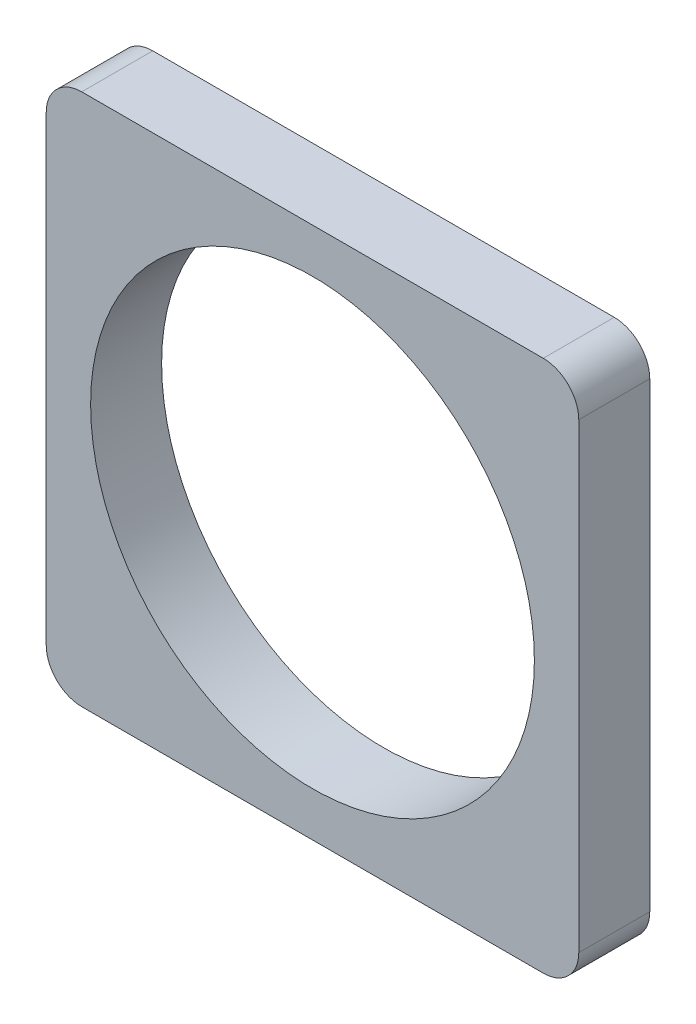
ISO-10303-21;
HEADER;
FILE_DESCRIPTION(('STEP AP214'),'2;1');
FILE_NAME('part.step','',(''),(''),'','','');
FILE_SCHEMA(('AUTOMOTIVE_DESIGN { 1 0 10303 214 1 1 1 1 }'));
ENDSEC;
DATA;
#1=APPLICATION_CONTEXT('core data for automotive mechanical design processes');
#2=APPLICATION_PROTOCOL_DEFINITION('international standard','automotive_design',2000,#1);
#3=PRODUCT_CONTEXT('',#1,'mechanical');
#4=PRODUCT('Part','Part','',(#3));
#5=PRODUCT_RELATED_PRODUCT_CATEGORY('part','',(#4));
#6=PRODUCT_DEFINITION_FORMATION('','',#4);
#7=PRODUCT_DEFINITION_CONTEXT('part definition',#1,'design');
#8=PRODUCT_DEFINITION('design','',#6,#7);
#9=PRODUCT_DEFINITION_SHAPE('','',#8);
#10=(LENGTH_UNIT() NAMED_UNIT(*) SI_UNIT(.MILLI.,.METRE.));
#11=(NAMED_UNIT(*) PLANE_ANGLE_UNIT() SI_UNIT($,.RADIAN.));
#12=(NAMED_UNIT(*) SI_UNIT($,.STERADIAN.) SOLID_ANGLE_UNIT());
#13=UNCERTAINTY_MEASURE_WITH_UNIT(LENGTH_MEASURE(1.E-05),#10,'distance_accuracy_value','');
#14=(GEOMETRIC_REPRESENTATION_CONTEXT(3) GLOBAL_UNCERTAINTY_ASSIGNED_CONTEXT((#13)) GLOBAL_UNIT_ASSIGNED_CONTEXT((#10,
#11,#12)) REPRESENTATION_CONTEXT('',''));
#15=CARTESIAN_POINT('',(0.,0.,0.));
#16=DIRECTION('',(0.,0.,1.));
#17=DIRECTION('',(1.,0.,0.));
#18=AXIS2_PLACEMENT_3D('',#15,#16,#17);
#19=CARTESIAN_POINT('',(0.,0.,4.));
#20=DIRECTION('',(0.,0.,-1.));
#21=DIRECTION('',(-1.,0.,0.));
#22=AXIS2_PLACEMENT_3D('',#19,#20,#21);
#23=PLANE('',#22);
#24=DIRECTION('',(1.,0.,0.));
#25=VECTOR('',#24,1.);
#26=CARTESIAN_POINT('',(0.,0.,4.));
#27=LINE('',#26,#25);
#28=CARTESIAN_POINT('',(2.,0.,4.));
#29=VERTEX_POINT('',#28);
#30=CARTESIAN_POINT('',(28.,0.,4.));
#31=VERTEX_POINT('',#30);
#32=EDGE_CURVE('E169',#29,#31,#27,.T.);
#33=ORIENTED_EDGE('',*,*,#32,.T.);
#34=CARTESIAN_POINT('',(28.,2.,4.));
#35=DIRECTION('',(0.,0.,-1.));
#36=DIRECTION('',(-1.,0.,0.));
#37=AXIS2_PLACEMENT_3D('',#34,#35,#36);
#38=CIRCLE('',#37,2.);
#39=CARTESIAN_POINT('',(30.,2.,4.));
#40=VERTEX_POINT('',#39);
#41=EDGE_CURVE('E147',#31,#40,#38,.F.);
#42=ORIENTED_EDGE('',*,*,#41,.T.);
#43=DIRECTION('',(0.,1.,0.));
#44=VECTOR('',#43,1.);
#45=CARTESIAN_POINT('',(30.,0.,4.));
#46=LINE('',#45,#44);
#47=CARTESIAN_POINT('',(30.,28.,4.));
#48=VERTEX_POINT('',#47);
#49=EDGE_CURVE('E117',#40,#48,#46,.T.);
#50=ORIENTED_EDGE('',*,*,#49,.T.);
#51=CARTESIAN_POINT('',(28.,28.,4.));
#52=DIRECTION('',(0.,0.,-1.));
#53=DIRECTION('',(-1.,0.,0.));
#54=AXIS2_PLACEMENT_3D('',#51,#52,#53);
#55=CIRCLE('',#54,2.);
#56=CARTESIAN_POINT('',(28.,30.,4.));
#57=VERTEX_POINT('',#56);
#58=EDGE_CURVE('E53',#48,#57,#55,.F.);
#59=ORIENTED_EDGE('',*,*,#58,.T.);
#60=DIRECTION('',(-1.,0.,0.));
#61=VECTOR('',#60,1.);
#62=CARTESIAN_POINT('',(0.,30.,4.));
#63=LINE('',#62,#61);
#64=CARTESIAN_POINT('',(2.,30.,4.));
#65=VERTEX_POINT('',#64);
#66=EDGE_CURVE('E133',#57,#65,#63,.T.);
#67=ORIENTED_EDGE('',*,*,#66,.T.);
#68=CARTESIAN_POINT('',(2.,28.,4.));
#69=DIRECTION('',(0.,0.,-1.));
#70=DIRECTION('',(-1.,0.,0.));
#71=AXIS2_PLACEMENT_3D('',#68,#69,#70);
#72=CIRCLE('',#71,2.);
#73=CARTESIAN_POINT('',(0.,28.,4.));
#74=VERTEX_POINT('',#73);
#75=EDGE_CURVE('E143',#65,#74,#72,.F.);
#76=ORIENTED_EDGE('',*,*,#75,.T.);
#77=DIRECTION('',(0.,-1.,0.));
#78=VECTOR('',#77,1.);
#79=CARTESIAN_POINT('',(0.,0.,4.));
#80=LINE('',#79,#78);
#81=CARTESIAN_POINT('',(0.,2.,4.));
#82=VERTEX_POINT('',#81);
#83=EDGE_CURVE('E127',#74,#82,#80,.T.);
#84=ORIENTED_EDGE('',*,*,#83,.T.);
#85=CARTESIAN_POINT('',(2.,2.,4.));
#86=DIRECTION('',(0.,0.,-1.));
#87=DIRECTION('',(-1.,0.,0.));
#88=AXIS2_PLACEMENT_3D('',#85,#86,#87);
#89=CIRCLE('',#88,2.);
#90=EDGE_CURVE('E145',#82,#29,#89,.F.);
#91=ORIENTED_EDGE('',*,*,#90,.T.);
#92=EDGE_LOOP('',(#33,#42,#50,#59,#67,#76,#84,#91));
#93=FACE_BOUND('',#92,.T.);
#94=CARTESIAN_POINT('',(15.,15.,4.));
#95=DIRECTION('',(0.,0.,1.));
#96=DIRECTION('',(1.,0.,0.));
#97=AXIS2_PLACEMENT_3D('',#94,#95,#96);
#98=CIRCLE('',#97,12.5);
#99=CARTESIAN_POINT('',(27.5,15.,4.));
#100=VERTEX_POINT('',#99);
#101=EDGE_CURVE('E178',#100,#100,#98,.T.);
#102=ORIENTED_EDGE('',*,*,#101,.F.);
#103=EDGE_LOOP('',(#102));
#104=FACE_BOUND('',#103,.T.);
#105=ADVANCED_FACE('F33',(#93,#104),#23,.F.);
#106=CARTESIAN_POINT('',(0.,0.,0.));
#107=DIRECTION('',(0.,0.,-1.));
#108=DIRECTION('',(-1.,0.,0.));
#109=AXIS2_PLACEMENT_3D('',#106,#107,#108);
#110=PLANE('',#109);
#111=DIRECTION('',(0.,1.,0.));
#112=VECTOR('',#111,1.);
#113=CARTESIAN_POINT('',(30.,0.,0.));
#114=LINE('',#113,#112);
#115=CARTESIAN_POINT('',(30.,2.,0.));
#116=VERTEX_POINT('',#115);
#117=CARTESIAN_POINT('',(30.,28.,0.));
#118=VERTEX_POINT('',#117);
#119=EDGE_CURVE('E115',#116,#118,#114,.T.);
#120=ORIENTED_EDGE('',*,*,#119,.F.);
#121=CARTESIAN_POINT('',(28.,2.,0.));
#122=DIRECTION('',(0.,0.,-1.));
#123=DIRECTION('',(-1.,0.,0.));
#124=AXIS2_PLACEMENT_3D('',#121,#122,#123);
#125=CIRCLE('',#124,2.);
#126=CARTESIAN_POINT('',(28.,0.,0.));
#127=VERTEX_POINT('',#126);
#128=EDGE_CURVE('E98',#116,#127,#125,.T.);
#129=ORIENTED_EDGE('',*,*,#128,.T.);
#130=DIRECTION('',(1.,0.,0.));
#131=VECTOR('',#130,1.);
#132=CARTESIAN_POINT('',(0.,0.,0.));
#133=LINE('',#132,#131);
#134=CARTESIAN_POINT('',(2.,0.,0.));
#135=VERTEX_POINT('',#134);
#136=EDGE_CURVE('E125',#135,#127,#133,.T.);
#137=ORIENTED_EDGE('',*,*,#136,.F.);
#138=CARTESIAN_POINT('',(2.,2.,0.));
#139=DIRECTION('',(0.,0.,-1.));
#140=DIRECTION('',(-1.,0.,0.));
#141=AXIS2_PLACEMENT_3D('',#138,#139,#140);
#142=CIRCLE('',#141,2.);
#143=CARTESIAN_POINT('',(0.,2.,0.));
#144=VERTEX_POINT('',#143);
#145=EDGE_CURVE('E109',#135,#144,#142,.T.);
#146=ORIENTED_EDGE('',*,*,#145,.T.);
#147=DIRECTION('',(0.,-1.,0.));
#148=VECTOR('',#147,1.);
#149=CARTESIAN_POINT('',(0.,0.,0.));
#150=LINE('',#149,#148);
#151=CARTESIAN_POINT('',(0.,28.,0.));
#152=VERTEX_POINT('',#151);
#153=EDGE_CURVE('E129',#152,#144,#150,.T.);
#154=ORIENTED_EDGE('',*,*,#153,.F.);
#155=CARTESIAN_POINT('',(2.,28.,0.));
#156=DIRECTION('',(0.,0.,-1.));
#157=DIRECTION('',(-1.,0.,0.));
#158=AXIS2_PLACEMENT_3D('',#155,#156,#157);
#159=CIRCLE('',#158,2.);
#160=CARTESIAN_POINT('',(2.,30.,0.));
#161=VERTEX_POINT('',#160);
#162=EDGE_CURVE('E136',#152,#161,#159,.T.);
#163=ORIENTED_EDGE('',*,*,#162,.T.);
#164=DIRECTION('',(-1.,0.,0.));
#165=VECTOR('',#164,1.);
#166=CARTESIAN_POINT('',(0.,30.,0.));
#167=LINE('',#166,#165);
#168=CARTESIAN_POINT('',(28.,30.,0.));
#169=VERTEX_POINT('',#168);
#170=EDGE_CURVE('E124',#169,#161,#167,.T.);
#171=ORIENTED_EDGE('',*,*,#170,.F.);
#172=CARTESIAN_POINT('',(28.,28.,0.));
#173=DIRECTION('',(0.,0.,-1.));
#174=DIRECTION('',(-1.,0.,0.));
#175=AXIS2_PLACEMENT_3D('',#172,#173,#174);
#176=CIRCLE('',#175,2.);
#177=EDGE_CURVE('E118',#169,#118,#176,.T.);
#178=ORIENTED_EDGE('',*,*,#177,.T.);
#179=EDGE_LOOP('',(#120,#129,#137,#146,#154,#163,#171,#178));
#180=FACE_BOUND('',#179,.T.);
#181=CARTESIAN_POINT('',(15.,15.,0.));
#182=DIRECTION('',(0.,0.,1.));
#183=DIRECTION('',(1.,0.,0.));
#184=AXIS2_PLACEMENT_3D('',#181,#182,#183);
#185=CIRCLE('',#184,12.5);
#186=CARTESIAN_POINT('',(27.5,15.,0.));
#187=VERTEX_POINT('',#186);
#188=EDGE_CURVE('E174',#187,#187,#185,.T.);
#189=ORIENTED_EDGE('',*,*,#188,.T.);
#190=EDGE_LOOP('',(#189));
#191=FACE_BOUND('',#190,.T.);
#192=ADVANCED_FACE('F121',(#180,#191),#110,.T.);
#193=CARTESIAN_POINT('',(0.,0.,4.));
#194=DIRECTION('',(1.,0.,0.));
#195=DIRECTION('',(0.,0.,-1.));
#196=AXIS2_PLACEMENT_3D('',#193,#194,#195);
#197=PLANE('',#196);
#198=ORIENTED_EDGE('',*,*,#153,.T.);
#199=DIRECTION('',(0.,0.,-1.));
#200=VECTOR('',#199,1.);
#201=CARTESIAN_POINT('',(0.,2.,4.));
#202=LINE('',#201,#200);
#203=EDGE_CURVE('E152',#144,#82,#202,.F.);
#204=ORIENTED_EDGE('',*,*,#203,.T.);
#205=ORIENTED_EDGE('',*,*,#83,.F.);
#206=DIRECTION('',(0.,0.,-1.));
#207=VECTOR('',#206,1.);
#208=CARTESIAN_POINT('',(0.,28.,4.));
#209=LINE('',#208,#207);
#210=EDGE_CURVE('E149',#74,#152,#209,.T.);
#211=ORIENTED_EDGE('',*,*,#210,.T.);
#212=EDGE_LOOP('',(#198,#204,#205,#211));
#213=FACE_BOUND('',#212,.T.);
#214=ADVANCED_FACE('F165',(#213),#197,.F.);
#215=CARTESIAN_POINT('',(0.,0.,4.));
#216=DIRECTION('',(0.,1.,0.));
#217=DIRECTION('',(0.,0.,1.));
#218=AXIS2_PLACEMENT_3D('',#215,#216,#217);
#219=PLANE('',#218);
#220=ORIENTED_EDGE('',*,*,#136,.T.);
#221=DIRECTION('',(0.,0.,-1.));
#222=VECTOR('',#221,1.);
#223=CARTESIAN_POINT('',(28.,0.,4.));
#224=LINE('',#223,#222);
#225=EDGE_CURVE('E103',#127,#31,#224,.F.);
#226=ORIENTED_EDGE('',*,*,#225,.T.);
#227=ORIENTED_EDGE('',*,*,#32,.F.);
#228=DIRECTION('',(0.,0.,-1.));
#229=VECTOR('',#228,1.);
#230=CARTESIAN_POINT('',(2.,0.,4.));
#231=LINE('',#230,#229);
#232=EDGE_CURVE('E108',#29,#135,#231,.T.);
#233=ORIENTED_EDGE('',*,*,#232,.T.);
#234=EDGE_LOOP('',(#220,#226,#227,#233));
#235=FACE_BOUND('',#234,.T.);
#236=ADVANCED_FACE('F206',(#235),#219,.F.);
#237=CARTESIAN_POINT('',(30.,0.,4.));
#238=DIRECTION('',(-1.,0.,0.));
#239=DIRECTION('',(0.,0.,1.));
#240=AXIS2_PLACEMENT_3D('',#237,#238,#239);
#241=PLANE('',#240);
#242=ORIENTED_EDGE('',*,*,#49,.F.);
#243=DIRECTION('',(0.,0.,-1.));
#244=VECTOR('',#243,1.);
#245=CARTESIAN_POINT('',(30.,2.,4.));
#246=LINE('',#245,#244);
#247=EDGE_CURVE('E102',#40,#116,#246,.T.);
#248=ORIENTED_EDGE('',*,*,#247,.T.);
#249=ORIENTED_EDGE('',*,*,#119,.T.);
#250=DIRECTION('',(0.,0.,-1.));
#251=VECTOR('',#250,1.);
#252=CARTESIAN_POINT('',(30.,28.,4.));
#253=LINE('',#252,#251);
#254=EDGE_CURVE('E119',#118,#48,#253,.F.);
#255=ORIENTED_EDGE('',*,*,#254,.T.);
#256=EDGE_LOOP('',(#242,#248,#249,#255));
#257=FACE_BOUND('',#256,.T.);
#258=ADVANCED_FACE('F114',(#257),#241,.F.);
#259=CARTESIAN_POINT('',(0.,30.,4.));
#260=DIRECTION('',(0.,-1.,0.));
#261=DIRECTION('',(0.,0.,-1.));
#262=AXIS2_PLACEMENT_3D('',#259,#260,#261);
#263=PLANE('',#262);
#264=ORIENTED_EDGE('',*,*,#170,.T.);
#265=DIRECTION('',(0.,0.,-1.));
#266=VECTOR('',#265,1.);
#267=CARTESIAN_POINT('',(2.,30.,4.));
#268=LINE('',#267,#266);
#269=EDGE_CURVE('E11',#161,#65,#268,.F.);
#270=ORIENTED_EDGE('',*,*,#269,.T.);
#271=ORIENTED_EDGE('',*,*,#66,.F.);
#272=DIRECTION('',(0.,0.,-1.));
#273=VECTOR('',#272,1.);
#274=CARTESIAN_POINT('',(28.,30.,4.));
#275=LINE('',#274,#273);
#276=EDGE_CURVE('E41',#57,#169,#275,.T.);
#277=ORIENTED_EDGE('',*,*,#276,.T.);
#278=EDGE_LOOP('',(#264,#270,#271,#277));
#279=FACE_BOUND('',#278,.T.);
#280=ADVANCED_FACE('F155',(#279),#263,.F.);
#281=CARTESIAN_POINT('',(15.,15.,4.));
#282=DIRECTION('',(0.,0.,-1.));
#283=DIRECTION('',(-1.,0.,0.));
#284=AXIS2_PLACEMENT_3D('',#281,#282,#283);
#285=CYLINDRICAL_SURFACE('',#284,12.5);
#286=ORIENTED_EDGE('',*,*,#101,.T.);
#287=EDGE_LOOP('',(#286));
#288=FACE_BOUND('',#287,.T.);
#289=ORIENTED_EDGE('',*,*,#188,.F.);
#290=EDGE_LOOP('',(#289));
#291=FACE_BOUND('',#290,.T.);
#292=ADVANCED_FACE('F185',(#288,#291),#285,.F.);
#293=CARTESIAN_POINT('',(28.,2.,4.));
#294=DIRECTION('',(0.,0.,-1.));
#295=DIRECTION('',(-1.,0.,0.));
#296=AXIS2_PLACEMENT_3D('',#293,#294,#295);
#297=CYLINDRICAL_SURFACE('',#296,2.);
#298=ORIENTED_EDGE('',*,*,#41,.F.);
#299=ORIENTED_EDGE('',*,*,#225,.F.);
#300=ORIENTED_EDGE('',*,*,#128,.F.);
#301=ORIENTED_EDGE('',*,*,#247,.F.);
#302=EDGE_LOOP('',(#298,#299,#300,#301));
#303=FACE_BOUND('',#302,.T.);
#304=ADVANCED_FACE('F101',(#303),#297,.T.);
#305=CARTESIAN_POINT('',(2.,2.,4.));
#306=DIRECTION('',(0.,0.,-1.));
#307=DIRECTION('',(-1.,0.,0.));
#308=AXIS2_PLACEMENT_3D('',#305,#306,#307);
#309=CYLINDRICAL_SURFACE('',#308,2.);
#310=ORIENTED_EDGE('',*,*,#90,.F.);
#311=ORIENTED_EDGE('',*,*,#203,.F.);
#312=ORIENTED_EDGE('',*,*,#145,.F.);
#313=ORIENTED_EDGE('',*,*,#232,.F.);
#314=EDGE_LOOP('',(#310,#311,#312,#313));
#315=FACE_BOUND('',#314,.T.);
#316=ADVANCED_FACE('F192',(#315),#309,.T.);
#317=CARTESIAN_POINT('',(2.,28.,4.));
#318=DIRECTION('',(0.,0.,-1.));
#319=DIRECTION('',(-1.,0.,0.));
#320=AXIS2_PLACEMENT_3D('',#317,#318,#319);
#321=CYLINDRICAL_SURFACE('',#320,2.);
#322=ORIENTED_EDGE('',*,*,#75,.F.);
#323=ORIENTED_EDGE('',*,*,#269,.F.);
#324=ORIENTED_EDGE('',*,*,#162,.F.);
#325=ORIENTED_EDGE('',*,*,#210,.F.);
#326=EDGE_LOOP('',(#322,#323,#324,#325));
#327=FACE_BOUND('',#326,.T.);
#328=ADVANCED_FACE('F162',(#327),#321,.T.);
#329=CARTESIAN_POINT('',(28.,28.,4.));
#330=DIRECTION('',(0.,0.,-1.));
#331=DIRECTION('',(-1.,0.,0.));
#332=AXIS2_PLACEMENT_3D('',#329,#330,#331);
#333=CYLINDRICAL_SURFACE('',#332,2.);
#334=ORIENTED_EDGE('',*,*,#58,.F.);
#335=ORIENTED_EDGE('',*,*,#254,.F.);
#336=ORIENTED_EDGE('',*,*,#177,.F.);
#337=ORIENTED_EDGE('',*,*,#276,.F.);
#338=EDGE_LOOP('',(#334,#335,#336,#337));
#339=FACE_BOUND('',#338,.T.);
#340=ADVANCED_FACE('F35',(#339),#333,.T.);
#341=CLOSED_SHELL('',(#105,#192,#214,#236,#258,#280,#292,#304,#316,#328,#340));
#342=MANIFOLD_SOLID_BREP('B2',#341);
#343=ADVANCED_BREP_SHAPE_REPRESENTATION('',(#18,#342),#14);
#344=SHAPE_DEFINITION_REPRESENTATION(#9,#343);
ENDSEC;
END-ISO-10303-21;
